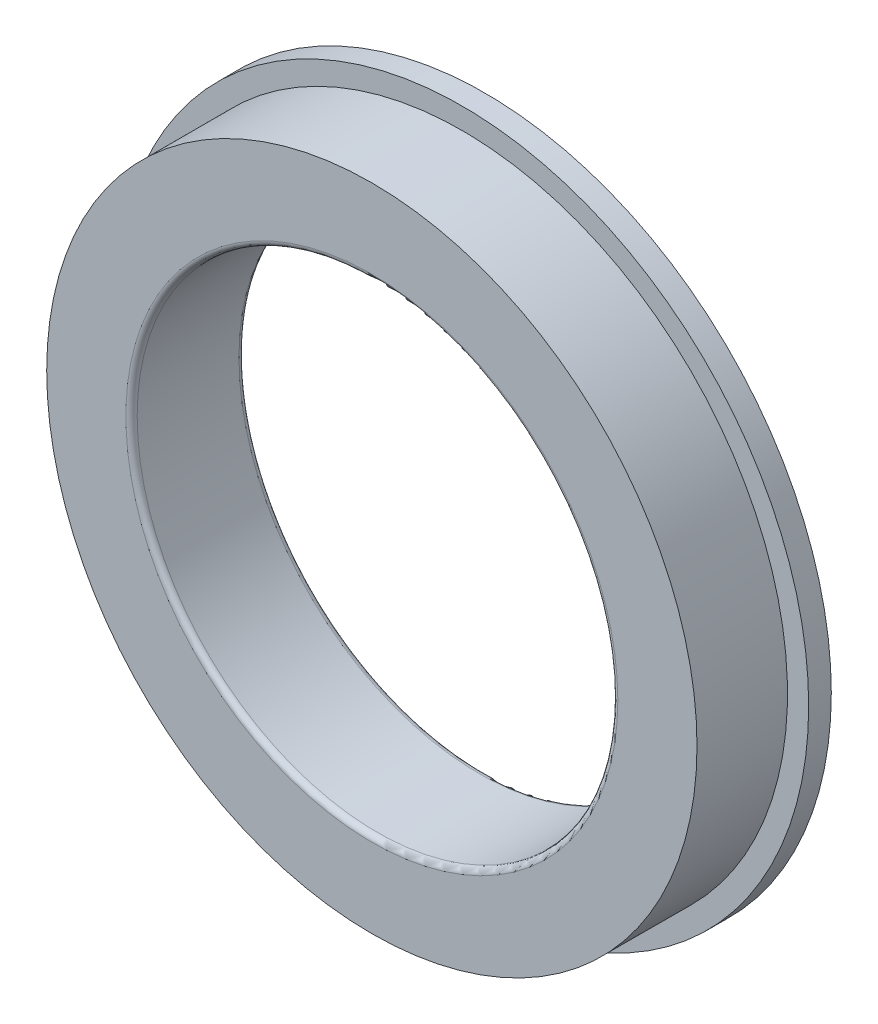
ISO-10303-21;
HEADER;
FILE_DESCRIPTION(('STEP AP214'),'2;1');
FILE_NAME('part.step','',(''),(''),'','','');
FILE_SCHEMA(('AUTOMOTIVE_DESIGN { 1 0 10303 214 1 1 1 1 }'));
ENDSEC;
DATA;
#1=APPLICATION_CONTEXT('core data for automotive mechanical design processes');
#2=APPLICATION_PROTOCOL_DEFINITION('international standard','automotive_design',2000,#1);
#3=PRODUCT_CONTEXT('',#1,'mechanical');
#4=PRODUCT('Part','Part','',(#3));
#5=PRODUCT_RELATED_PRODUCT_CATEGORY('part','',(#4));
#6=PRODUCT_DEFINITION_FORMATION('','',#4);
#7=PRODUCT_DEFINITION_CONTEXT('part definition',#1,'design');
#8=PRODUCT_DEFINITION('design','',#6,#7);
#9=PRODUCT_DEFINITION_SHAPE('','',#8);
#10=(LENGTH_UNIT() NAMED_UNIT(*) SI_UNIT(.MILLI.,.METRE.));
#11=(NAMED_UNIT(*) PLANE_ANGLE_UNIT() SI_UNIT($,.RADIAN.));
#12=(NAMED_UNIT(*) SI_UNIT($,.STERADIAN.) SOLID_ANGLE_UNIT());
#13=UNCERTAINTY_MEASURE_WITH_UNIT(LENGTH_MEASURE(1.E-05),#10,'distance_accuracy_value','');
#14=(GEOMETRIC_REPRESENTATION_CONTEXT(3) GLOBAL_UNCERTAINTY_ASSIGNED_CONTEXT((#13)) GLOBAL_UNIT_ASSIGNED_CONTEXT((#10,
#11,#12)) REPRESENTATION_CONTEXT('',''));
#15=CARTESIAN_POINT('',(0.,0.,0.));
#16=DIRECTION('',(0.,0.,1.));
#17=DIRECTION('',(1.,0.,0.));
#18=AXIS2_PLACEMENT_3D('',#15,#16,#17);
#19=CARTESIAN_POINT('',(0.,0.,4.));
#20=DIRECTION('',(0.,0.,-1.));
#21=DIRECTION('',(-1.,0.,0.));
#22=AXIS2_PLACEMENT_3D('',#19,#20,#21);
#23=CYLINDRICAL_SURFACE('',#22,11.5);
#24=CARTESIAN_POINT('',(0.,0.,4.));
#25=DIRECTION('',(0.,0.,1.));
#26=DIRECTION('',(1.,0.,0.));
#27=AXIS2_PLACEMENT_3D('',#24,#25,#26);
#28=CIRCLE('',#27,11.5);
#29=CARTESIAN_POINT('',(11.5,0.,4.));
#30=VERTEX_POINT('',#29);
#31=EDGE_CURVE('E66',#30,#30,#28,.T.);
#32=ORIENTED_EDGE('',*,*,#31,.F.);
#33=EDGE_LOOP('',(#32));
#34=FACE_BOUND('',#33,.T.);
#35=CARTESIAN_POINT('',(0.,0.,0.8));
#36=DIRECTION('',(0.,0.,-1.));
#37=DIRECTION('',(-1.,0.,0.));
#38=AXIS2_PLACEMENT_3D('',#35,#36,#37);
#39=CIRCLE('',#38,11.5);
#40=CARTESIAN_POINT('',(-11.5,0.,0.8));
#41=VERTEX_POINT('',#40);
#42=EDGE_CURVE('E63',#41,#41,#39,.T.);
#43=ORIENTED_EDGE('',*,*,#42,.F.);
#44=EDGE_LOOP('',(#43));
#45=FACE_BOUND('',#44,.T.);
#46=ADVANCED_FACE('F43',(#34,#45),#23,.T.);
#47=CARTESIAN_POINT('',(0.,0.,4.));
#48=DIRECTION('',(0.,0.,1.));
#49=DIRECTION('',(1.,0.,0.));
#50=AXIS2_PLACEMENT_3D('',#47,#48,#49);
#51=PLANE('',#50);
#52=CARTESIAN_POINT('',(0.,0.,4.));
#53=DIRECTION('',(0.,0.,1.));
#54=DIRECTION('',(1.,0.,0.));
#55=AXIS2_PLACEMENT_3D('',#52,#53,#54);
#56=CIRCLE('',#55,8.7);
#57=CARTESIAN_POINT('',(8.7,0.,4.));
#58=VERTEX_POINT('',#57);
#59=EDGE_CURVE('E50',#58,#58,#56,.F.);
#60=ORIENTED_EDGE('',*,*,#59,.T.);
#61=EDGE_LOOP('',(#60));
#62=FACE_BOUND('',#61,.T.);
#63=ORIENTED_EDGE('',*,*,#31,.T.);
#64=EDGE_LOOP('',(#63));
#65=FACE_BOUND('',#64,.T.);
#66=ADVANCED_FACE('F92',(#62,#65),#51,.T.);
#67=CARTESIAN_POINT('',(0.,0.,0.));
#68=DIRECTION('',(0.,0.,1.));
#69=DIRECTION('',(1.,0.,0.));
#70=AXIS2_PLACEMENT_3D('',#67,#68,#69);
#71=PLANE('',#70);
#72=CARTESIAN_POINT('',(0.,0.,0.));
#73=DIRECTION('',(0.,0.,1.));
#74=DIRECTION('',(1.,0.,0.));
#75=AXIS2_PLACEMENT_3D('',#72,#73,#74);
#76=CIRCLE('',#75,8.7);
#77=CARTESIAN_POINT('',(8.7,0.,0.));
#78=VERTEX_POINT('',#77);
#79=EDGE_CURVE('E11',#78,#78,#76,.T.);
#80=ORIENTED_EDGE('',*,*,#79,.T.);
#81=EDGE_LOOP('',(#80));
#82=FACE_BOUND('',#81,.T.);
#83=CARTESIAN_POINT('',(0.,0.,0.));
#84=DIRECTION('',(0.,0.,-1.));
#85=DIRECTION('',(-1.,0.,0.));
#86=AXIS2_PLACEMENT_3D('',#83,#84,#85);
#87=CIRCLE('',#86,12.25);
#88=CARTESIAN_POINT('',(-12.25,0.,0.));
#89=VERTEX_POINT('',#88);
#90=EDGE_CURVE('E70',#89,#89,#87,.T.);
#91=ORIENTED_EDGE('',*,*,#90,.T.);
#92=EDGE_LOOP('',(#91));
#93=FACE_BOUND('',#92,.T.);
#94=ADVANCED_FACE('F98',(#82,#93),#71,.F.);
#95=CARTESIAN_POINT('',(0.,0.,4.));
#96=DIRECTION('',(0.,0.,-1.));
#97=DIRECTION('',(-1.,0.,0.));
#98=AXIS2_PLACEMENT_3D('',#95,#96,#97);
#99=CYLINDRICAL_SURFACE('',#98,8.5);
#100=CARTESIAN_POINT('',(0.,0.,3.8));
#101=DIRECTION('',(0.,0.,1.));
#102=DIRECTION('',(1.,0.,0.));
#103=AXIS2_PLACEMENT_3D('',#100,#101,#102);
#104=CIRCLE('',#103,8.5);
#105=CARTESIAN_POINT('',(8.5,0.,3.8));
#106=VERTEX_POINT('',#105);
#107=EDGE_CURVE('E54',#106,#106,#104,.T.);
#108=ORIENTED_EDGE('',*,*,#107,.T.);
#109=EDGE_LOOP('',(#108));
#110=FACE_BOUND('',#109,.T.);
#111=CARTESIAN_POINT('',(0.,0.,0.2));
#112=DIRECTION('',(0.,0.,1.));
#113=DIRECTION('',(1.,0.,0.));
#114=AXIS2_PLACEMENT_3D('',#111,#112,#113);
#115=CIRCLE('',#114,8.5);
#116=CARTESIAN_POINT('',(8.5,0.,0.2));
#117=VERTEX_POINT('',#116);
#118=EDGE_CURVE('E58',#117,#117,#115,.F.);
#119=ORIENTED_EDGE('',*,*,#118,.T.);
#120=EDGE_LOOP('',(#119));
#121=FACE_BOUND('',#120,.T.);
#122=ADVANCED_FACE('F89',(#110,#121),#99,.F.);
#123=CARTESIAN_POINT('',(0.,0.,0.8));
#124=DIRECTION('',(0.,0.,-1.));
#125=DIRECTION('',(-1.,0.,0.));
#126=AXIS2_PLACEMENT_3D('',#123,#124,#125);
#127=CYLINDRICAL_SURFACE('',#126,12.25);
#128=CARTESIAN_POINT('',(0.,0.,0.8));
#129=DIRECTION('',(0.,0.,-1.));
#130=DIRECTION('',(-1.,0.,0.));
#131=AXIS2_PLACEMENT_3D('',#128,#129,#130);
#132=CIRCLE('',#131,12.25);
#133=CARTESIAN_POINT('',(-12.25,0.,0.8));
#134=VERTEX_POINT('',#133);
#135=EDGE_CURVE('E69',#134,#134,#132,.T.);
#136=ORIENTED_EDGE('',*,*,#135,.T.);
#137=EDGE_LOOP('',(#136));
#138=FACE_BOUND('',#137,.T.);
#139=ORIENTED_EDGE('',*,*,#90,.F.);
#140=EDGE_LOOP('',(#139));
#141=FACE_BOUND('',#140,.T.);
#142=ADVANCED_FACE('F76',(#138,#141),#127,.T.);
#143=CARTESIAN_POINT('',(0.,0.,0.8));
#144=DIRECTION('',(0.,0.,-1.));
#145=DIRECTION('',(-1.,0.,0.));
#146=AXIS2_PLACEMENT_3D('',#143,#144,#145);
#147=PLANE('',#146);
#148=ORIENTED_EDGE('',*,*,#42,.T.);
#149=EDGE_LOOP('',(#148));
#150=FACE_BOUND('',#149,.T.);
#151=ORIENTED_EDGE('',*,*,#135,.F.);
#152=EDGE_LOOP('',(#151));
#153=FACE_BOUND('',#152,.T.);
#154=ADVANCED_FACE('F79',(#150,#153),#147,.F.);
#155=CARTESIAN_POINT('',(0.,0.,3.8));
#156=DIRECTION('',(0.,0.,1.));
#157=DIRECTION('',(1.,0.,0.));
#158=AXIS2_PLACEMENT_3D('',#155,#156,#157);
#159=TOROIDAL_SURFACE('',#158,8.7,0.2);
#160=ORIENTED_EDGE('',*,*,#59,.F.);
#161=EDGE_LOOP('',(#160));
#162=FACE_BOUND('',#161,.T.);
#163=ORIENTED_EDGE('',*,*,#107,.F.);
#164=EDGE_LOOP('',(#163));
#165=FACE_BOUND('',#164,.T.);
#166=ADVANCED_FACE('F81',(#162,#165),#159,.T.);
#167=CARTESIAN_POINT('',(0.,0.,0.2));
#168=DIRECTION('',(0.,0.,1.));
#169=DIRECTION('',(1.,0.,0.));
#170=AXIS2_PLACEMENT_3D('',#167,#168,#169);
#171=TOROIDAL_SURFACE('',#170,8.7,0.2);
#172=ORIENTED_EDGE('',*,*,#118,.F.);
#173=EDGE_LOOP('',(#172));
#174=FACE_BOUND('',#173,.T.);
#175=ORIENTED_EDGE('',*,*,#79,.F.);
#176=EDGE_LOOP('',(#175));
#177=FACE_BOUND('',#176,.T.);
#178=ADVANCED_FACE('F45',(#174,#177),#171,.T.);
#179=CLOSED_SHELL('',(#46,#66,#94,#122,#142,#154,#166,#178));
#180=MANIFOLD_SOLID_BREP('B2',#179);
#181=ADVANCED_BREP_SHAPE_REPRESENTATION('',(#18,#180),#14);
#182=SHAPE_DEFINITION_REPRESENTATION(#9,#181);
ENDSEC;
END-ISO-10303-21;
